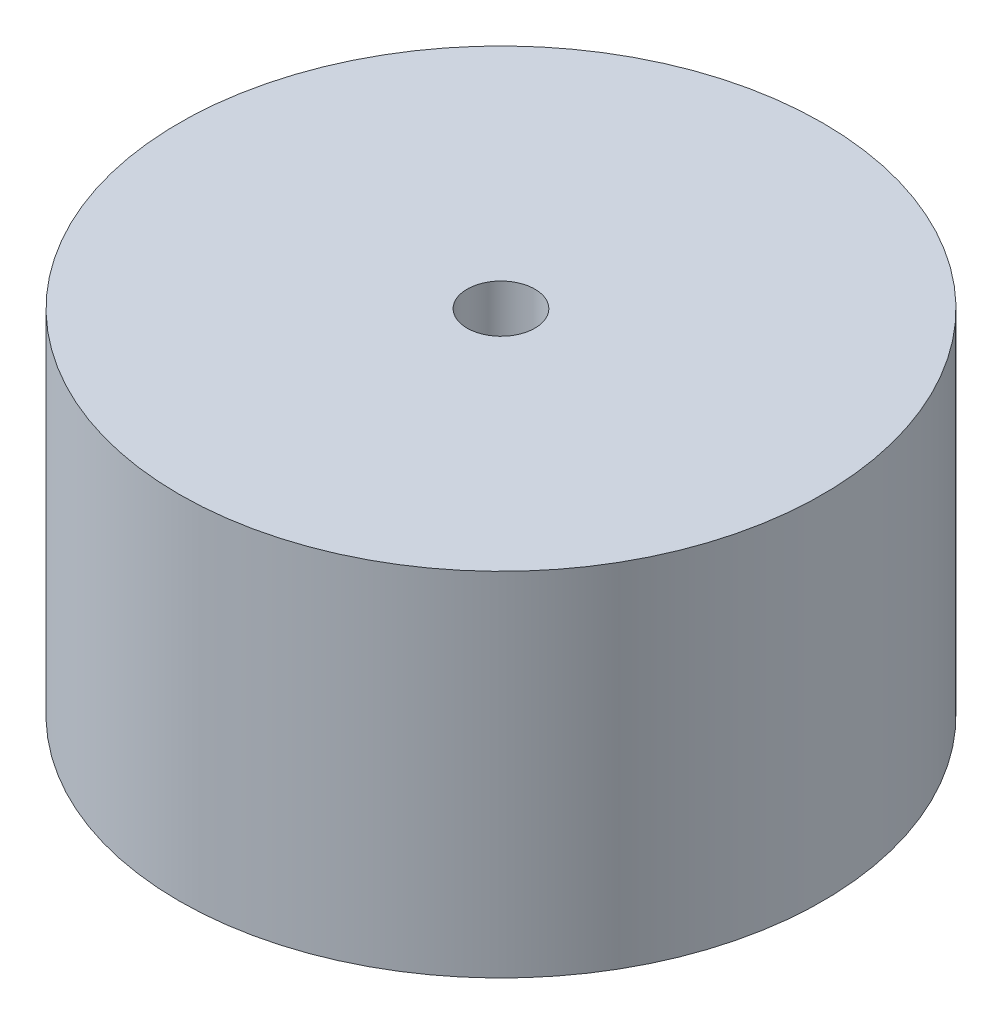
ISO-10303-21;
HEADER;
FILE_DESCRIPTION(('STEP AP214'),'2;1');
FILE_NAME('part.step','',(''),(''),'','','');
FILE_SCHEMA(('AUTOMOTIVE_DESIGN { 1 0 10303 214 1 1 1 1 }'));
ENDSEC;
DATA;
#1=APPLICATION_CONTEXT('core data for automotive mechanical design processes');
#2=APPLICATION_PROTOCOL_DEFINITION('international standard','automotive_design',2000,#1);
#3=PRODUCT_CONTEXT('',#1,'mechanical');
#4=PRODUCT('Part','Part','',(#3));
#5=PRODUCT_RELATED_PRODUCT_CATEGORY('part','',(#4));
#6=PRODUCT_DEFINITION_FORMATION('','',#4);
#7=PRODUCT_DEFINITION_CONTEXT('part definition',#1,'design');
#8=PRODUCT_DEFINITION('design','',#6,#7);
#9=PRODUCT_DEFINITION_SHAPE('','',#8);
#10=(LENGTH_UNIT() NAMED_UNIT(*) SI_UNIT(.MILLI.,.METRE.));
#11=(NAMED_UNIT(*) PLANE_ANGLE_UNIT() SI_UNIT($,.RADIAN.));
#12=(NAMED_UNIT(*) SI_UNIT($,.STERADIAN.) SOLID_ANGLE_UNIT());
#13=UNCERTAINTY_MEASURE_WITH_UNIT(LENGTH_MEASURE(1.E-05),#10,'distance_accuracy_value','');
#14=(GEOMETRIC_REPRESENTATION_CONTEXT(3) GLOBAL_UNCERTAINTY_ASSIGNED_CONTEXT((#13)) GLOBAL_UNIT_ASSIGNED_CONTEXT((#10,
#11,#12)) REPRESENTATION_CONTEXT('',''));
#15=CARTESIAN_POINT('',(0.,0.,0.));
#16=DIRECTION('',(0.,0.,1.));
#17=DIRECTION('',(1.,0.,0.));
#18=AXIS2_PLACEMENT_3D('',#15,#16,#17);
#19=CARTESIAN_POINT('',(0.,4.,0.));
#20=DIRECTION('',(0.,-1.,0.));
#21=DIRECTION('',(0.,0.,-1.));
#22=AXIS2_PLACEMENT_3D('',#19,#20,#21);
#23=CYLINDRICAL_SURFACE('',#22,15.);
#24=CARTESIAN_POINT('',(0.,4.,0.));
#25=DIRECTION('',(0.,1.,0.));
#26=DIRECTION('',(0.,0.,1.));
#27=AXIS2_PLACEMENT_3D('',#24,#25,#26);
#28=CIRCLE('',#27,15.);
#29=CARTESIAN_POINT('',(0.,4.,15.));
#30=VERTEX_POINT('',#29);
#31=EDGE_CURVE('E10',#30,#30,#28,.T.);
#32=ORIENTED_EDGE('',*,*,#31,.F.);
#33=EDGE_LOOP('',(#32));
#34=FACE_BOUND('',#33,.T.);
#35=CARTESIAN_POINT('',(0.,0.,0.));
#36=DIRECTION('',(0.,1.,0.));
#37=DIRECTION('',(0.,0.,1.));
#38=AXIS2_PLACEMENT_3D('',#35,#36,#37);
#39=CIRCLE('',#38,15.);
#40=CARTESIAN_POINT('',(0.,0.,15.));
#41=VERTEX_POINT('',#40);
#42=EDGE_CURVE('E41',#41,#41,#39,.T.);
#43=ORIENTED_EDGE('',*,*,#42,.T.);
#44=EDGE_LOOP('',(#43));
#45=FACE_BOUND('',#44,.T.);
#46=ADVANCED_FACE('F38',(#34,#45),#23,.T.);
#47=CARTESIAN_POINT('',(0.,0.,0.));
#48=DIRECTION('',(0.,1.,0.));
#49=DIRECTION('',(0.,0.,1.));
#50=AXIS2_PLACEMENT_3D('',#47,#48,#49);
#51=PLANE('',#50);
#52=CARTESIAN_POINT('',(0.,0.,0.));
#53=DIRECTION('',(0.,1.,0.));
#54=DIRECTION('',(0.,0.,1.));
#55=AXIS2_PLACEMENT_3D('',#52,#53,#54);
#56=CIRCLE('',#55,2.5);
#57=CARTESIAN_POINT('',(0.,0.,2.5));
#58=VERTEX_POINT('',#57);
#59=EDGE_CURVE('E56',#58,#58,#56,.T.);
#60=ORIENTED_EDGE('',*,*,#59,.T.);
#61=EDGE_LOOP('',(#60));
#62=FACE_BOUND('',#61,.T.);
#63=ORIENTED_EDGE('',*,*,#42,.F.);
#64=EDGE_LOOP('',(#63));
#65=FACE_BOUND('',#64,.T.);
#66=ADVANCED_FACE('F123',(#62,#65),#51,.F.);
#67=CARTESIAN_POINT('',(0.,30.,0.));
#68=DIRECTION('',(0.,-1.,0.));
#69=DIRECTION('',(0.,0.,-1.));
#70=AXIS2_PLACEMENT_3D('',#67,#68,#69);
#71=CYLINDRICAL_SURFACE('',#70,23.75);
#72=CARTESIAN_POINT('',(0.,30.,0.));
#73=DIRECTION('',(0.,1.,0.));
#74=DIRECTION('',(0.,0.,1.));
#75=AXIS2_PLACEMENT_3D('',#72,#73,#74);
#76=CIRCLE('',#75,23.75);
#77=CARTESIAN_POINT('',(0.,30.,-23.75));
#78=VERTEX_POINT('',#77);
#79=EDGE_CURVE('E50',#78,#78,#76,.T.);
#80=CARTESIAN_POINT('',(0.,4.,0.));
#81=DIRECTION('',(0.,1.,0.));
#82=DIRECTION('',(0.,0.,1.));
#83=AXIS2_PLACEMENT_3D('',#80,#81,#82);
#84=CIRCLE('',#83,23.75);
#85=CARTESIAN_POINT('',(0.,4.,-23.75));
#86=VERTEX_POINT('',#85);
#87=EDGE_CURVE('E52',#86,#86,#84,.T.);
#88=CARTESIAN_POINT('',(0.,30.,-23.75));
#89=CARTESIAN_POINT('',(0.,29.7291666666667,-23.75));
#90=CARTESIAN_POINT('',(0.,29.4583333333333,-23.75));
#91=CARTESIAN_POINT('',(0.,28.9166666666667,-23.75));
#92=CARTESIAN_POINT('',(0.,28.6458333333333,-23.75));
#93=CARTESIAN_POINT('',(0.,28.1041666666667,-23.75));
#94=CARTESIAN_POINT('',(0.,27.8333333333333,-23.75));
#95=CARTESIAN_POINT('',(0.,27.2916666666667,-23.75));
#96=CARTESIAN_POINT('',(0.,27.0208333333333,-23.75));
#97=CARTESIAN_POINT('',(0.,26.4791666666667,-23.75));
#98=CARTESIAN_POINT('',(0.,26.2083333333333,-23.75));
#99=CARTESIAN_POINT('',(0.,25.6666666666667,-23.75));
#100=CARTESIAN_POINT('',(0.,25.3958333333333,-23.75));
#101=CARTESIAN_POINT('',(0.,24.8541666666667,-23.75));
#102=CARTESIAN_POINT('',(0.,24.5833333333333,-23.75));
#103=CARTESIAN_POINT('',(0.,24.0416666666667,-23.75));
#104=CARTESIAN_POINT('',(0.,23.7708333333333,-23.75));
#105=CARTESIAN_POINT('',(0.,23.2291666666667,-23.75));
#106=CARTESIAN_POINT('',(0.,22.9583333333333,-23.75));
#107=CARTESIAN_POINT('',(0.,22.4166666666667,-23.75));
#108=CARTESIAN_POINT('',(0.,22.1458333333333,-23.75));
#109=CARTESIAN_POINT('',(0.,21.6041666666667,-23.75));
#110=CARTESIAN_POINT('',(0.,21.3333333333333,-23.75));
#111=CARTESIAN_POINT('',(0.,20.7916666666667,-23.75));
#112=CARTESIAN_POINT('',(0.,20.5208333333333,-23.75));
#113=CARTESIAN_POINT('',(0.,19.9791666666667,-23.75));
#114=CARTESIAN_POINT('',(0.,19.7083333333333,-23.75));
#115=CARTESIAN_POINT('',(0.,19.1666666666667,-23.75));
#116=CARTESIAN_POINT('',(0.,18.8958333333333,-23.75));
#117=CARTESIAN_POINT('',(0.,18.3541666666667,-23.75));
#118=CARTESIAN_POINT('',(0.,18.0833333333333,-23.75));
#119=CARTESIAN_POINT('',(0.,17.5416666666667,-23.75));
#120=CARTESIAN_POINT('',(0.,17.2708333333333,-23.75));
#121=CARTESIAN_POINT('',(0.,16.7291666666667,-23.75));
#122=CARTESIAN_POINT('',(0.,16.4583333333333,-23.75));
#123=CARTESIAN_POINT('',(0.,15.9166666666667,-23.75));
#124=CARTESIAN_POINT('',(0.,15.6458333333333,-23.75));
#125=CARTESIAN_POINT('',(0.,15.1041666666667,-23.75));
#126=CARTESIAN_POINT('',(0.,14.8333333333333,-23.75));
#127=CARTESIAN_POINT('',(0.,14.2916666666667,-23.75));
#128=CARTESIAN_POINT('',(0.,14.0208333333333,-23.75));
#129=CARTESIAN_POINT('',(0.,13.4791666666667,-23.75));
#130=CARTESIAN_POINT('',(0.,13.2083333333333,-23.75));
#131=CARTESIAN_POINT('',(0.,12.6666666666667,-23.75));
#132=CARTESIAN_POINT('',(0.,12.3958333333333,-23.75));
#133=CARTESIAN_POINT('',(0.,11.8541666666667,-23.75));
#134=CARTESIAN_POINT('',(0.,11.5833333333333,-23.75));
#135=CARTESIAN_POINT('',(0.,11.0416666666667,-23.75));
#136=CARTESIAN_POINT('',(0.,10.7708333333333,-23.75));
#137=CARTESIAN_POINT('',(0.,10.2291666666667,-23.75));
#138=CARTESIAN_POINT('',(0.,9.95833333333333,-23.75));
#139=CARTESIAN_POINT('',(0.,9.41666666666667,-23.75));
#140=CARTESIAN_POINT('',(0.,9.14583333333333,-23.75));
#141=CARTESIAN_POINT('',(0.,8.60416666666667,-23.75));
#142=CARTESIAN_POINT('',(0.,8.33333333333333,-23.75));
#143=CARTESIAN_POINT('',(0.,7.79166666666667,-23.75));
#144=CARTESIAN_POINT('',(0.,7.52083333333333,-23.75));
#145=CARTESIAN_POINT('',(0.,6.97916666666667,-23.75));
#146=CARTESIAN_POINT('',(0.,6.70833333333333,-23.75));
#147=CARTESIAN_POINT('',(0.,6.16666666666667,-23.75));
#148=CARTESIAN_POINT('',(0.,5.89583333333333,-23.75));
#149=CARTESIAN_POINT('',(0.,5.35416666666667,-23.75));
#150=CARTESIAN_POINT('',(0.,5.08333333333333,-23.75));
#151=CARTESIAN_POINT('',(0.,4.54166666666667,-23.75));
#152=CARTESIAN_POINT('',(0.,4.27083333333333,-23.75));
#153=CARTESIAN_POINT('',(0.,4.,-23.75));
#154=B_SPLINE_CURVE_WITH_KNOTS('',3,(#88,#89,#90,#91,#92,#93,#94,#95,#96,#97,#98,#99,#100,#101,
#102,#103,#104,#105,#106,#107,#108,#109,#110,#111,#112,#113,#114,#115,#116,#117,#118,#119,#120,
#121,#122,#123,#124,#125,#126,#127,#128,#129,#130,#131,#132,#133,#134,#135,#136,#137,#138,#139,
#140,#141,#142,#143,#144,#145,#146,#147,#148,#149,#150,#151,#152,#153),.UNSPECIFIED.,.F.,.F.,(4,
2,2,2,2,2,2,2,2,2,2,2,2,2,2,2,2,2,2,2,2,2,2,2,2,2,2,2,2,2,2,2,4),(0.,0.812500000000001,1.625,
2.4375,3.25,4.0625,4.875,5.6875,6.5,7.3125,8.125,8.9375,9.75,10.5625,11.375,12.1875,13.,13.8125,
14.625,15.4375,16.25,17.0625,17.875,18.6875,19.5,20.3125,21.125,21.9375,22.75,23.5625,24.375,
25.1875,26.),.UNSPECIFIED.);
#155=EDGE_CURVE('BSEAM118',#78,#86,#154,.T.);
#156=ORIENTED_EDGE('',*,*,#79,.F.);
#157=ORIENTED_EDGE('',*,*,#87,.T.);
#158=ORIENTED_EDGE('',*,*,#155,.T.);
#159=ORIENTED_EDGE('',*,*,#155,.F.);
#160=EDGE_LOOP('',(#156,#158,#157,#159));
#161=FACE_BOUND('',#160,.T.);
#162=ADVANCED_FACE('F118',(#161),#71,.T.);
#163=CARTESIAN_POINT('',(0.,30.,0.));
#164=DIRECTION('',(0.,1.,0.));
#165=DIRECTION('',(0.,0.,1.));
#166=AXIS2_PLACEMENT_3D('',#163,#164,#165);
#167=PLANE('',#166);
#168=CARTESIAN_POINT('',(0.,30.,0.));
#169=DIRECTION('',(0.,1.,0.));
#170=DIRECTION('',(0.,0.,1.));
#171=AXIS2_PLACEMENT_3D('',#168,#169,#170);
#172=CIRCLE('',#171,2.5);
#173=CARTESIAN_POINT('',(0.,30.,2.5));
#174=VERTEX_POINT('',#173);
#175=EDGE_CURVE('E63',#174,#174,#172,.T.);
#176=ORIENTED_EDGE('',*,*,#175,.F.);
#177=EDGE_LOOP('',(#176));
#178=FACE_BOUND('',#177,.T.);
#179=ORIENTED_EDGE('',*,*,#79,.T.);
#180=EDGE_LOOP('',(#179));
#181=FACE_BOUND('',#180,.T.);
#182=ADVANCED_FACE('F115',(#178,#181),#167,.T.);
#183=CARTESIAN_POINT('',(0.,4.,0.));
#184=DIRECTION('',(0.,1.,0.));
#185=DIRECTION('',(0.,0.,1.));
#186=AXIS2_PLACEMENT_3D('',#183,#184,#185);
#187=PLANE('',#186);
#188=ORIENTED_EDGE('',*,*,#31,.T.);
#189=EDGE_LOOP('',(#188));
#190=FACE_BOUND('',#189,.T.);
#191=ORIENTED_EDGE('',*,*,#87,.F.);
#192=EDGE_LOOP('',(#191));
#193=FACE_BOUND('',#192,.T.);
#194=ADVANCED_FACE('F113',(#190,#193),#187,.F.);
#195=CARTESIAN_POINT('',(0.,-10.,0.));
#196=DIRECTION('',(0.,1.,0.));
#197=DIRECTION('',(0.,0.,1.));
#198=AXIS2_PLACEMENT_3D('',#195,#196,#197);
#199=CYLINDRICAL_SURFACE('',#198,2.5);
#200=ORIENTED_EDGE('',*,*,#175,.T.);
#201=EDGE_LOOP('',(#200));
#202=FACE_BOUND('',#201,.T.);
#203=ORIENTED_EDGE('',*,*,#59,.F.);
#204=EDGE_LOOP('',(#203));
#205=FACE_BOUND('',#204,.T.);
#206=ADVANCED_FACE('F110',(#202,#205),#199,.F.);
#207=CLOSED_SHELL('',(#46,#66,#162,#182,#194,#206));
#208=CARTESIAN_POINT('',(0.,7.99999999999999,0.));
#209=DIRECTION('',(0.,1.,0.));
#210=DIRECTION('',(0.,0.,1.));
#211=AXIS2_PLACEMENT_3D('',#208,#209,#210);
#212=CYLINDRICAL_SURFACE('',#211,20.8407027689221);
#213=CARTESIAN_POINT('',(0.,7.99999999999999,0.));
#214=DIRECTION('',(0.,1.,0.));
#215=DIRECTION('',(0.,0.,1.));
#216=AXIS2_PLACEMENT_3D('',#213,#214,#215);
#217=CIRCLE('',#216,20.8407027689221);
#218=CARTESIAN_POINT('',(0.,7.99999999999999,20.8407027689221));
#219=VERTEX_POINT('',#218);
#220=EDGE_CURVE('E67',#219,#219,#217,.T.);
#221=ORIENTED_EDGE('',*,*,#220,.F.);
#222=EDGE_LOOP('',(#221));
#223=FACE_BOUND('',#222,.T.);
#224=CARTESIAN_POINT('',(0.,27.,0.));
#225=DIRECTION('',(0.,1.,0.));
#226=DIRECTION('',(0.,0.,1.));
#227=AXIS2_PLACEMENT_3D('',#224,#225,#226);
#228=CIRCLE('',#227,20.8407027689221);
#229=CARTESIAN_POINT('',(0.,27.,20.8407027689221));
#230=VERTEX_POINT('',#229);
#231=EDGE_CURVE('E68',#230,#230,#228,.T.);
#232=ORIENTED_EDGE('',*,*,#231,.T.);
#233=EDGE_LOOP('',(#232));
#234=FACE_BOUND('',#233,.T.);
#235=ADVANCED_FACE('F91',(#223,#234),#212,.F.);
#236=CARTESIAN_POINT('',(0.,7.99999999999999,0.));
#237=DIRECTION('',(0.,1.,0.));
#238=DIRECTION('',(0.,0.,1.));
#239=AXIS2_PLACEMENT_3D('',#236,#237,#238);
#240=PLANE('',#239);
#241=CARTESIAN_POINT('',(0.,7.99999999999999,0.));
#242=DIRECTION('',(0.,1.,0.));
#243=DIRECTION('',(0.,0.,1.));
#244=AXIS2_PLACEMENT_3D('',#241,#242,#243);
#245=CIRCLE('',#244,9.28174581769697);
#246=CARTESIAN_POINT('',(0.,7.99999999999999,9.28174581769697));
#247=VERTEX_POINT('',#246);
#248=EDGE_CURVE('E72',#247,#247,#245,.T.);
#249=ORIENTED_EDGE('',*,*,#248,.F.);
#250=EDGE_LOOP('',(#249));
#251=FACE_BOUND('',#250,.T.);
#252=ORIENTED_EDGE('',*,*,#220,.T.);
#253=EDGE_LOOP('',(#252));
#254=FACE_BOUND('',#253,.T.);
#255=ADVANCED_FACE('F87',(#251,#254),#240,.T.);
#256=CARTESIAN_POINT('',(0.,27.,0.));
#257=DIRECTION('',(0.,1.,0.));
#258=DIRECTION('',(0.,0.,1.));
#259=AXIS2_PLACEMENT_3D('',#256,#257,#258);
#260=PLANE('',#259);
#261=CARTESIAN_POINT('',(0.,27.,0.));
#262=DIRECTION('',(0.,1.,0.));
#263=DIRECTION('',(0.,0.,1.));
#264=AXIS2_PLACEMENT_3D('',#261,#262,#263);
#265=CIRCLE('',#264,9.28174581769697);
#266=CARTESIAN_POINT('',(0.,27.,9.28174581769697));
#267=VERTEX_POINT('',#266);
#268=EDGE_CURVE('E76',#267,#267,#265,.T.);
#269=ORIENTED_EDGE('',*,*,#268,.T.);
#270=EDGE_LOOP('',(#269));
#271=FACE_BOUND('',#270,.T.);
#272=ORIENTED_EDGE('',*,*,#231,.F.);
#273=EDGE_LOOP('',(#272));
#274=FACE_BOUND('',#273,.T.);
#275=ADVANCED_FACE('F90',(#271,#274),#260,.F.);
#276=CARTESIAN_POINT('',(0.,7.99999999999999,0.));
#277=DIRECTION('',(0.,1.,0.));
#278=DIRECTION('',(0.,0.,1.));
#279=AXIS2_PLACEMENT_3D('',#276,#277,#278);
#280=CYLINDRICAL_SURFACE('',#279,9.28174581769697);
#281=ORIENTED_EDGE('',*,*,#248,.T.);
#282=EDGE_LOOP('',(#281));
#283=FACE_BOUND('',#282,.T.);
#284=ORIENTED_EDGE('',*,*,#268,.F.);
#285=EDGE_LOOP('',(#284));
#286=FACE_BOUND('',#285,.T.);
#287=ADVANCED_FACE('F84',(#283,#286),#280,.T.);
#288=CLOSED_SHELL('',(#235,#255,#275,#287));
#289=ORIENTED_CLOSED_SHELL('',*,#288,.T.);
#290=BREP_WITH_VOIDS('B2',#207,(#289));
#291=ADVANCED_BREP_SHAPE_REPRESENTATION('',(#18,#290),#14);
#292=SHAPE_DEFINITION_REPRESENTATION(#9,#291);
ENDSEC;
END-ISO-10303-21;
